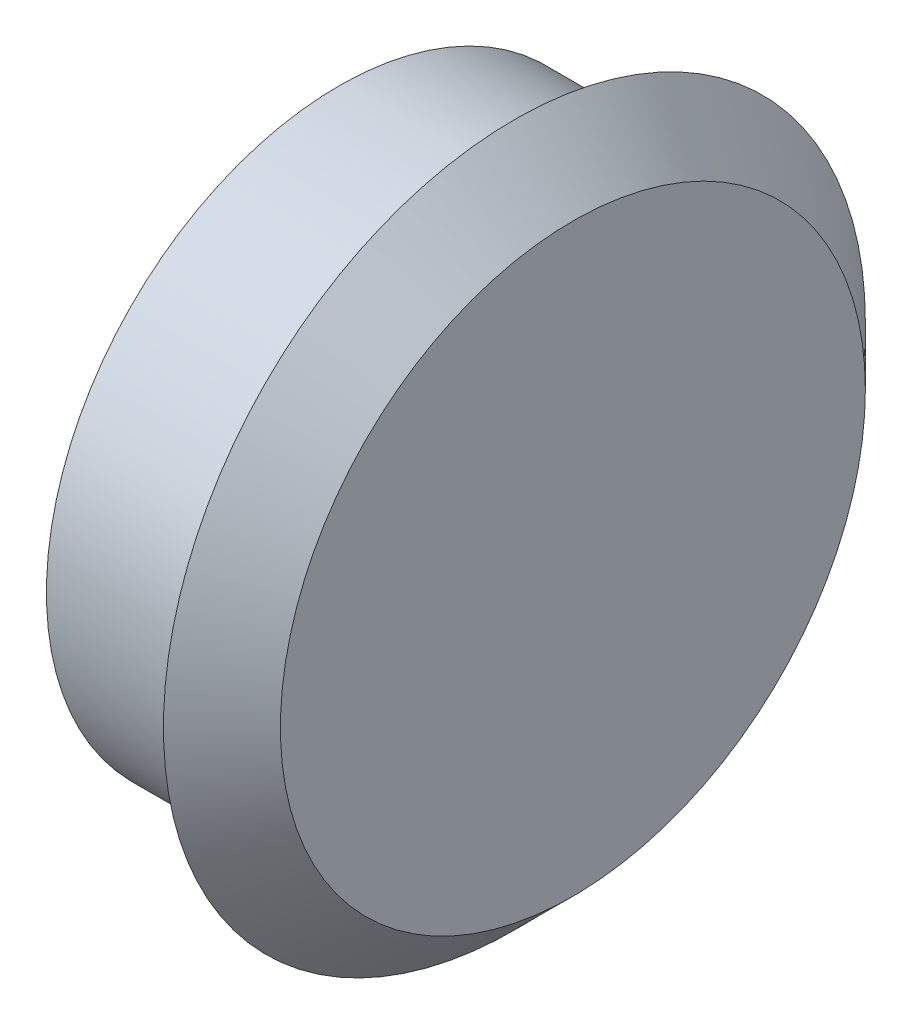
ISO-10303-21;
HEADER;
FILE_DESCRIPTION(('STEP AP214'),'2;1');
FILE_NAME('part.step','',(''),(''),'','','');
FILE_SCHEMA(('AUTOMOTIVE_DESIGN { 1 0 10303 214 1 1 1 1 }'));
ENDSEC;
DATA;
#1=APPLICATION_CONTEXT('core data for automotive mechanical design processes');
#2=APPLICATION_PROTOCOL_DEFINITION('international standard','automotive_design',2000,#1);
#3=PRODUCT_CONTEXT('',#1,'mechanical');
#4=PRODUCT('Part','Part','',(#3));
#5=PRODUCT_RELATED_PRODUCT_CATEGORY('part','',(#4));
#6=PRODUCT_DEFINITION_FORMATION('','',#4);
#7=PRODUCT_DEFINITION_CONTEXT('part definition',#1,'design');
#8=PRODUCT_DEFINITION('design','',#6,#7);
#9=PRODUCT_DEFINITION_SHAPE('','',#8);
#10=(LENGTH_UNIT() NAMED_UNIT(*) SI_UNIT(.MILLI.,.METRE.));
#11=(NAMED_UNIT(*) PLANE_ANGLE_UNIT() SI_UNIT($,.RADIAN.));
#12=(NAMED_UNIT(*) SI_UNIT($,.STERADIAN.) SOLID_ANGLE_UNIT());
#13=UNCERTAINTY_MEASURE_WITH_UNIT(LENGTH_MEASURE(1.E-05),#10,'distance_accuracy_value','');
#14=(GEOMETRIC_REPRESENTATION_CONTEXT(3) GLOBAL_UNCERTAINTY_ASSIGNED_CONTEXT((#13)) GLOBAL_UNIT_ASSIGNED_CONTEXT((#10,
#11,#12)) REPRESENTATION_CONTEXT('',''));
#15=CARTESIAN_POINT('',(0.,0.,0.));
#16=DIRECTION('',(0.,0.,1.));
#17=DIRECTION('',(1.,0.,0.));
#18=AXIS2_PLACEMENT_3D('',#15,#16,#17);
#19=CARTESIAN_POINT('',(0.,0.,0.));
#20=DIRECTION('',(1.,0.,0.));
#21=DIRECTION('',(0.,0.,-1.));
#22=AXIS2_PLACEMENT_3D('',#19,#20,#21);
#23=PLANE('',#22);
#24=CARTESIAN_POINT('',(0.,0.,0.));
#25=DIRECTION('',(1.,0.,0.));
#26=DIRECTION('',(0.,0.,-1.));
#27=AXIS2_PLACEMENT_3D('',#24,#25,#26);
#28=CIRCLE('',#27,50.);
#29=CARTESIAN_POINT('',(0.,0.,-50.));
#30=VERTEX_POINT('',#29);
#31=EDGE_CURVE('E50',#30,#30,#28,.T.);
#32=ORIENTED_EDGE('',*,*,#31,.F.);
#33=EDGE_LOOP('',(#32));
#34=FACE_BOUND('',#33,.T.);
#35=CARTESIAN_POINT('',(0.,0.,0.));
#36=DIRECTION('',(1.,0.,0.));
#37=DIRECTION('',(0.,0.,-1.));
#38=AXIS2_PLACEMENT_3D('',#35,#36,#37);
#39=CIRCLE('',#38,45.);
#40=CARTESIAN_POINT('',(0.,0.,-45.));
#41=VERTEX_POINT('',#40);
#42=EDGE_CURVE('E56',#41,#41,#39,.T.);
#43=ORIENTED_EDGE('',*,*,#42,.T.);
#44=EDGE_LOOP('',(#43));
#45=FACE_BOUND('',#44,.T.);
#46=ADVANCED_FACE('F37',(#34,#45),#23,.F.);
#47=CARTESIAN_POINT('',(30.,0.,0.));
#48=DIRECTION('',(-1.,0.,0.));
#49=DIRECTION('',(0.,0.,1.));
#50=AXIS2_PLACEMENT_3D('',#47,#48,#49);
#51=CYLINDRICAL_SURFACE('',#50,50.);
#52=CARTESIAN_POINT('',(30.,0.,0.));
#53=DIRECTION('',(1.,0.,0.));
#54=DIRECTION('',(0.,0.,-1.));
#55=AXIS2_PLACEMENT_3D('',#52,#53,#54);
#56=CIRCLE('',#55,50.);
#57=CARTESIAN_POINT('',(30.,0.,-50.));
#58=VERTEX_POINT('',#57);
#59=EDGE_CURVE('E45',#58,#58,#56,.T.);
#60=ORIENTED_EDGE('',*,*,#59,.F.);
#61=EDGE_LOOP('',(#60));
#62=FACE_BOUND('',#61,.T.);
#63=ORIENTED_EDGE('',*,*,#31,.T.);
#64=EDGE_LOOP('',(#63));
#65=FACE_BOUND('',#64,.T.);
#66=ADVANCED_FACE('F87',(#62,#65),#51,.T.);
#67=CARTESIAN_POINT('',(30.,0.,0.));
#68=DIRECTION('',(-1.,0.,0.));
#69=DIRECTION('',(0.,0.,1.));
#70=AXIS2_PLACEMENT_3D('',#67,#68,#69);
#71=CYLINDRICAL_SURFACE('',#70,45.);
#72=CARTESIAN_POINT('',(30.,0.,0.));
#73=DIRECTION('',(1.,0.,0.));
#74=DIRECTION('',(0.,0.,-1.));
#75=AXIS2_PLACEMENT_3D('',#72,#73,#74);
#76=CIRCLE('',#75,45.);
#77=CARTESIAN_POINT('',(30.,0.,-45.));
#78=VERTEX_POINT('',#77);
#79=EDGE_CURVE('E61',#78,#78,#76,.T.);
#80=ORIENTED_EDGE('',*,*,#79,.T.);
#81=EDGE_LOOP('',(#80));
#82=FACE_BOUND('',#81,.T.);
#83=ORIENTED_EDGE('',*,*,#42,.F.);
#84=EDGE_LOOP('',(#83));
#85=FACE_BOUND('',#84,.T.);
#86=ADVANCED_FACE('F84',(#82,#85),#71,.F.);
#87=CARTESIAN_POINT('',(30.,0.,0.));
#88=DIRECTION('',(1.,0.,0.));
#89=DIRECTION('',(0.,0.,-1.));
#90=AXIS2_PLACEMENT_3D('',#87,#88,#89);
#91=PLANE('',#90);
#92=ORIENTED_EDGE('',*,*,#79,.F.);
#93=EDGE_LOOP('',(#92));
#94=FACE_BOUND('',#93,.T.);
#95=ADVANCED_FACE('F76',(#94),#91,.F.);
#96=CARTESIAN_POINT('',(40.,0.,0.));
#97=DIRECTION('',(1.,0.,0.));
#98=DIRECTION('',(0.,0.,-1.));
#99=AXIS2_PLACEMENT_3D('',#96,#97,#98);
#100=PLANE('',#99);
#101=CARTESIAN_POINT('',(40.,0.,0.));
#102=DIRECTION('',(1.,0.,0.));
#103=DIRECTION('',(0.,0.,-1.));
#104=AXIS2_PLACEMENT_3D('',#101,#102,#103);
#105=CIRCLE('',#104,50.0000000000001);
#106=CARTESIAN_POINT('',(40.,0.,-50.0000000000001));
#107=VERTEX_POINT('',#106);
#108=EDGE_CURVE('E10',#107,#107,#105,.T.);
#109=ORIENTED_EDGE('',*,*,#108,.T.);
#110=EDGE_LOOP('',(#109));
#111=FACE_BOUND('',#110,.T.);
#112=ADVANCED_FACE('F74',(#111),#100,.T.);
#113=ORIENTED_EDGE('',*,*,#59,.T.);
#114=EDGE_LOOP('',(#113));
#115=FACE_BOUND('',#114,.T.);
#116=CARTESIAN_POINT('',(30.,0.,0.));
#117=DIRECTION('',(1.,0.,0.));
#118=DIRECTION('',(0.,0.,-1.));
#119=AXIS2_PLACEMENT_3D('',#116,#117,#118);
#120=CIRCLE('',#119,60.);
#121=CARTESIAN_POINT('',(30.,0.,-60.));
#122=VERTEX_POINT('',#121);
#123=EDGE_CURVE('E65',#122,#122,#120,.T.);
#124=ORIENTED_EDGE('',*,*,#123,.F.);
#125=EDGE_LOOP('',(#124));
#126=FACE_BOUND('',#125,.T.);
#127=ADVANCED_FACE('F72',(#115,#126),#91,.F.);
#128=CARTESIAN_POINT('',(40.,0.,0.));
#129=DIRECTION('',(-1.,0.,0.));
#130=DIRECTION('',(0.,0.,1.));
#131=AXIS2_PLACEMENT_3D('',#128,#129,#130);
#132=CONICAL_SURFACE('',#131,50.0000000000001,0.785398163397445);
#133=ORIENTED_EDGE('',*,*,#123,.T.);
#134=EDGE_LOOP('',(#133));
#135=FACE_BOUND('',#134,.T.);
#136=ORIENTED_EDGE('',*,*,#108,.F.);
#137=EDGE_LOOP('',(#136));
#138=FACE_BOUND('',#137,.T.);
#139=ADVANCED_FACE('F39',(#135,#138),#132,.T.);
#140=CLOSED_SHELL('',(#46,#66,#86,#95,#112,#127,#139));
#141=MANIFOLD_SOLID_BREP('B2',#140);
#142=ADVANCED_BREP_SHAPE_REPRESENTATION('',(#18,#141),#14);
#143=SHAPE_DEFINITION_REPRESENTATION(#9,#142);
ENDSEC;
END-ISO-10303-21;
